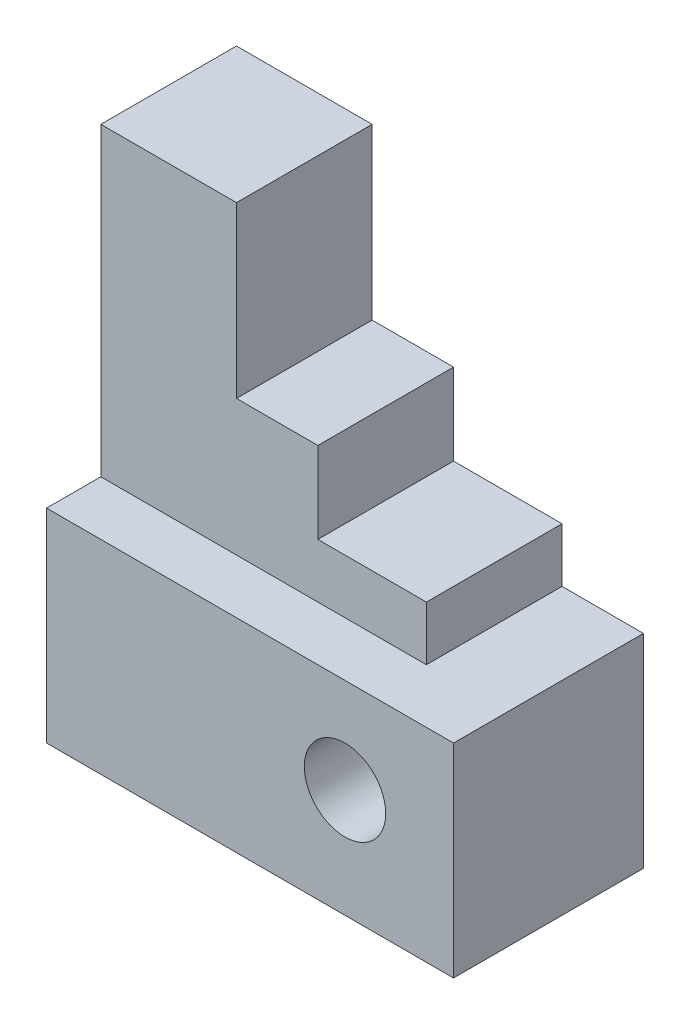
ISO-10303-21;
HEADER;
FILE_DESCRIPTION(('STEP AP214'),'2;1');
FILE_NAME('part.step','',(''),(''),'','','');
FILE_SCHEMA(('AUTOMOTIVE_DESIGN { 1 0 10303 214 1 1 1 1 }'));
ENDSEC;
DATA;
#1=APPLICATION_CONTEXT('core data for automotive mechanical design processes');
#2=APPLICATION_PROTOCOL_DEFINITION('international standard','automotive_design',2000,#1);
#3=PRODUCT_CONTEXT('',#1,'mechanical');
#4=PRODUCT('Part','Part','',(#3));
#5=PRODUCT_RELATED_PRODUCT_CATEGORY('part','',(#4));
#6=PRODUCT_DEFINITION_FORMATION('','',#4);
#7=PRODUCT_DEFINITION_CONTEXT('part definition',#1,'design');
#8=PRODUCT_DEFINITION('design','',#6,#7);
#9=PRODUCT_DEFINITION_SHAPE('','',#8);
#10=(LENGTH_UNIT() NAMED_UNIT(*) SI_UNIT(.MILLI.,.METRE.));
#11=(NAMED_UNIT(*) PLANE_ANGLE_UNIT() SI_UNIT($,.RADIAN.));
#12=(NAMED_UNIT(*) SI_UNIT($,.STERADIAN.) SOLID_ANGLE_UNIT());
#13=UNCERTAINTY_MEASURE_WITH_UNIT(LENGTH_MEASURE(1.E-05),#10,'distance_accuracy_value','');
#14=(GEOMETRIC_REPRESENTATION_CONTEXT(3) GLOBAL_UNCERTAINTY_ASSIGNED_CONTEXT((#13)) GLOBAL_UNIT_ASSIGNED_CONTEXT((#10,
#11,#12)) REPRESENTATION_CONTEXT('',''));
#15=CARTESIAN_POINT('',(0.,0.,0.));
#16=DIRECTION('',(0.,0.,1.));
#17=DIRECTION('',(1.,0.,0.));
#18=AXIS2_PLACEMENT_3D('',#15,#16,#17);
#19=CARTESIAN_POINT('',(0.,30.,28.));
#20=DIRECTION('',(0.,-1.,0.));
#21=DIRECTION('',(1.,0.,0.));
#22=AXIS2_PLACEMENT_3D('',#19,#20,#21);
#23=PLANE('',#22);
#24=DIRECTION('',(0.,0.,-1.));
#25=VECTOR('',#24,1.);
#26=CARTESIAN_POINT('',(48.,30.,20.));
#27=LINE('',#26,#25);
#28=CARTESIAN_POINT('',(48.,30.,20.));
#29=VERTEX_POINT('',#28);
#30=CARTESIAN_POINT('',(48.,30.,0.));
#31=VERTEX_POINT('',#30);
#32=EDGE_CURVE('E190',#29,#31,#27,.T.);
#33=ORIENTED_EDGE('',*,*,#32,.F.);
#34=DIRECTION('',(-1.,0.,0.));
#35=VECTOR('',#34,1.);
#36=CARTESIAN_POINT('',(0.,30.,20.));
#37=LINE('',#36,#35);
#38=CARTESIAN_POINT('',(0.,30.,20.));
#39=VERTEX_POINT('',#38);
#40=EDGE_CURVE('E162',#29,#39,#37,.T.);
#41=ORIENTED_EDGE('',*,*,#40,.T.);
#42=DIRECTION('',(0.,0.,-1.));
#43=VECTOR('',#42,1.);
#44=CARTESIAN_POINT('',(0.,30.,28.));
#45=LINE('',#44,#43);
#46=CARTESIAN_POINT('',(0.,30.,28.));
#47=VERTEX_POINT('',#46);
#48=EDGE_CURVE('E11',#47,#39,#45,.T.);
#49=ORIENTED_EDGE('',*,*,#48,.F.);
#50=DIRECTION('',(-1.,0.,0.));
#51=VECTOR('',#50,1.);
#52=CARTESIAN_POINT('',(0.,30.,28.));
#53=LINE('',#52,#51);
#54=CARTESIAN_POINT('',(60.,30.,28.));
#55=VERTEX_POINT('',#54);
#56=EDGE_CURVE('E232',#55,#47,#53,.T.);
#57=ORIENTED_EDGE('',*,*,#56,.F.);
#58=DIRECTION('',(0.,0.,-1.));
#59=VECTOR('',#58,1.);
#60=CARTESIAN_POINT('',(60.,30.,28.));
#61=LINE('',#60,#59);
#62=CARTESIAN_POINT('',(60.,30.,0.));
#63=VERTEX_POINT('',#62);
#64=EDGE_CURVE('E242',#55,#63,#61,.T.);
#65=ORIENTED_EDGE('',*,*,#64,.T.);
#66=DIRECTION('',(-1.,0.,0.));
#67=VECTOR('',#66,1.);
#68=CARTESIAN_POINT('',(0.,30.,0.));
#69=LINE('',#68,#67);
#70=EDGE_CURVE('E246',#63,#31,#69,.T.);
#71=ORIENTED_EDGE('',*,*,#70,.T.);
#72=EDGE_LOOP('',(#33,#41,#49,#57,#65,#71));
#73=FACE_BOUND('',#72,.T.);
#74=ADVANCED_FACE('F49',(#73),#23,.F.);
#75=CARTESIAN_POINT('',(0.,0.,28.));
#76=DIRECTION('',(1.,0.,0.));
#77=DIRECTION('',(0.,0.,-1.));
#78=AXIS2_PLACEMENT_3D('',#75,#76,#77);
#79=PLANE('',#78);
#80=DIRECTION('',(0.,-1.,0.));
#81=VECTOR('',#80,1.);
#82=CARTESIAN_POINT('',(0.,0.,0.));
#83=LINE('',#82,#81);
#84=CARTESIAN_POINT('',(0.,75.,0.));
#85=VERTEX_POINT('',#84);
#86=CARTESIAN_POINT('',(0.,0.,0.));
#87=VERTEX_POINT('',#86);
#88=EDGE_CURVE('E250',#85,#87,#83,.T.);
#89=ORIENTED_EDGE('',*,*,#88,.T.);
#90=DIRECTION('',(0.,0.,-1.));
#91=VECTOR('',#90,1.);
#92=CARTESIAN_POINT('',(0.,0.,28.));
#93=LINE('',#92,#91);
#94=CARTESIAN_POINT('',(0.,0.,28.));
#95=VERTEX_POINT('',#94);
#96=EDGE_CURVE('E58',#95,#87,#93,.T.);
#97=ORIENTED_EDGE('',*,*,#96,.F.);
#98=DIRECTION('',(0.,-1.,0.));
#99=VECTOR('',#98,1.);
#100=CARTESIAN_POINT('',(0.,0.,28.));
#101=LINE('',#100,#99);
#102=EDGE_CURVE('E99',#47,#95,#101,.T.);
#103=ORIENTED_EDGE('',*,*,#102,.F.);
#104=ORIENTED_EDGE('',*,*,#48,.T.);
#105=DIRECTION('',(0.,1.,0.));
#106=VECTOR('',#105,1.);
#107=CARTESIAN_POINT('',(0.,0.,20.));
#108=LINE('',#107,#106);
#109=CARTESIAN_POINT('',(0.,75.,20.));
#110=VERTEX_POINT('',#109);
#111=EDGE_CURVE('E65',#39,#110,#108,.T.);
#112=ORIENTED_EDGE('',*,*,#111,.T.);
#113=DIRECTION('',(0.,0.,-1.));
#114=VECTOR('',#113,1.);
#115=CARTESIAN_POINT('',(0.,75.,20.));
#116=LINE('',#115,#114);
#117=EDGE_CURVE('E213',#110,#85,#116,.T.);
#118=ORIENTED_EDGE('',*,*,#117,.T.);
#119=EDGE_LOOP('',(#89,#97,#103,#104,#112,#118));
#120=FACE_BOUND('',#119,.T.);
#121=ADVANCED_FACE('F289',(#120),#79,.F.);
#122=CARTESIAN_POINT('',(0.,0.,28.));
#123=DIRECTION('',(0.,1.,0.));
#124=DIRECTION('',(0.,0.,1.));
#125=AXIS2_PLACEMENT_3D('',#122,#123,#124);
#126=PLANE('',#125);
#127=DIRECTION('',(1.,0.,0.));
#128=VECTOR('',#127,1.);
#129=CARTESIAN_POINT('',(0.,0.,0.));
#130=LINE('',#129,#128);
#131=CARTESIAN_POINT('',(60.,0.,0.));
#132=VERTEX_POINT('',#131);
#133=EDGE_CURVE('E253',#87,#132,#130,.T.);
#134=ORIENTED_EDGE('',*,*,#133,.T.);
#135=DIRECTION('',(0.,0.,-1.));
#136=VECTOR('',#135,1.);
#137=CARTESIAN_POINT('',(60.,0.,28.));
#138=LINE('',#137,#136);
#139=CARTESIAN_POINT('',(60.,0.,28.));
#140=VERTEX_POINT('',#139);
#141=EDGE_CURVE('E260',#140,#132,#138,.T.);
#142=ORIENTED_EDGE('',*,*,#141,.F.);
#143=DIRECTION('',(1.,0.,0.));
#144=VECTOR('',#143,1.);
#145=CARTESIAN_POINT('',(0.,0.,28.));
#146=LINE('',#145,#144);
#147=EDGE_CURVE('E237',#95,#140,#146,.T.);
#148=ORIENTED_EDGE('',*,*,#147,.F.);
#149=ORIENTED_EDGE('',*,*,#96,.T.);
#150=EDGE_LOOP('',(#134,#142,#148,#149));
#151=FACE_BOUND('',#150,.T.);
#152=ADVANCED_FACE('F267',(#151),#126,.F.);
#153=CARTESIAN_POINT('',(44.,16.,28.));
#154=DIRECTION('',(0.,0.,-1.));
#155=DIRECTION('',(-1.,0.,0.));
#156=AXIS2_PLACEMENT_3D('',#153,#154,#155);
#157=CYLINDRICAL_SURFACE('',#156,5.99999999999999);
#158=CARTESIAN_POINT('',(44.,16.,28.));
#159=DIRECTION('',(0.,0.,1.));
#160=DIRECTION('',(1.,0.,0.));
#161=AXIS2_PLACEMENT_3D('',#158,#159,#160);
#162=CIRCLE('',#161,5.99999999999999);
#163=CARTESIAN_POINT('',(50.,16.,28.));
#164=VERTEX_POINT('',#163);
#165=EDGE_CURVE('E228',#164,#164,#162,.T.);
#166=ORIENTED_EDGE('',*,*,#165,.T.);
#167=EDGE_LOOP('',(#166));
#168=FACE_BOUND('',#167,.T.);
#169=CARTESIAN_POINT('',(44.,16.,0.));
#170=DIRECTION('',(0.,0.,1.));
#171=DIRECTION('',(1.,0.,0.));
#172=AXIS2_PLACEMENT_3D('',#169,#170,#171);
#173=CIRCLE('',#172,5.99999999999999);
#174=CARTESIAN_POINT('',(50.,16.,0.));
#175=VERTEX_POINT('',#174);
#176=EDGE_CURVE('E154',#175,#175,#173,.T.);
#177=ORIENTED_EDGE('',*,*,#176,.F.);
#178=EDGE_LOOP('',(#177));
#179=FACE_BOUND('',#178,.T.);
#180=ADVANCED_FACE('F51',(#168,#179),#157,.F.);
#181=CARTESIAN_POINT('',(60.,0.,28.));
#182=DIRECTION('',(-1.,0.,0.));
#183=DIRECTION('',(0.,0.,1.));
#184=AXIS2_PLACEMENT_3D('',#181,#182,#183);
#185=PLANE('',#184);
#186=DIRECTION('',(0.,1.,0.));
#187=VECTOR('',#186,1.);
#188=CARTESIAN_POINT('',(60.,0.,0.));
#189=LINE('',#188,#187);
#190=EDGE_CURVE('E92',#132,#63,#189,.T.);
#191=ORIENTED_EDGE('',*,*,#190,.T.);
#192=ORIENTED_EDGE('',*,*,#64,.F.);
#193=DIRECTION('',(0.,1.,0.));
#194=VECTOR('',#193,1.);
#195=CARTESIAN_POINT('',(60.,0.,28.));
#196=LINE('',#195,#194);
#197=EDGE_CURVE('E74',#140,#55,#196,.T.);
#198=ORIENTED_EDGE('',*,*,#197,.F.);
#199=ORIENTED_EDGE('',*,*,#141,.T.);
#200=EDGE_LOOP('',(#191,#192,#198,#199));
#201=FACE_BOUND('',#200,.T.);
#202=ADVANCED_FACE('F275',(#201),#185,.F.);
#203=CARTESIAN_POINT('',(0.,0.,28.));
#204=DIRECTION('',(0.,0.,1.));
#205=DIRECTION('',(1.,0.,0.));
#206=AXIS2_PLACEMENT_3D('',#203,#204,#205);
#207=PLANE('',#206);
#208=ORIENTED_EDGE('',*,*,#165,.F.);
#209=EDGE_LOOP('',(#208));
#210=FACE_BOUND('',#209,.T.);
#211=ORIENTED_EDGE('',*,*,#56,.T.);
#212=ORIENTED_EDGE('',*,*,#102,.T.);
#213=ORIENTED_EDGE('',*,*,#147,.T.);
#214=ORIENTED_EDGE('',*,*,#197,.T.);
#215=EDGE_LOOP('',(#211,#212,#213,#214));
#216=FACE_BOUND('',#215,.T.);
#217=ADVANCED_FACE('F277',(#210,#216),#207,.T.);
#218=CARTESIAN_POINT('',(0.,0.,0.));
#219=DIRECTION('',(0.,0.,1.));
#220=DIRECTION('',(1.,0.,0.));
#221=AXIS2_PLACEMENT_3D('',#218,#219,#220);
#222=PLANE('',#221);
#223=ORIENTED_EDGE('',*,*,#176,.T.);
#224=EDGE_LOOP('',(#223));
#225=FACE_BOUND('',#224,.T.);
#226=ORIENTED_EDGE('',*,*,#70,.F.);
#227=ORIENTED_EDGE('',*,*,#190,.F.);
#228=ORIENTED_EDGE('',*,*,#133,.F.);
#229=ORIENTED_EDGE('',*,*,#88,.F.);
#230=DIRECTION('',(1.,0.,0.));
#231=VECTOR('',#230,1.);
#232=CARTESIAN_POINT('',(0.,75.,0.));
#233=LINE('',#232,#231);
#234=CARTESIAN_POINT('',(20.,75.,0.));
#235=VERTEX_POINT('',#234);
#236=EDGE_CURVE('E165',#85,#235,#233,.T.);
#237=ORIENTED_EDGE('',*,*,#236,.T.);
#238=DIRECTION('',(0.,-1.,0.));
#239=VECTOR('',#238,1.);
#240=CARTESIAN_POINT('',(20.,0.,0.));
#241=LINE('',#240,#239);
#242=CARTESIAN_POINT('',(20.,50.,0.));
#243=VERTEX_POINT('',#242);
#244=EDGE_CURVE('E204',#235,#243,#241,.T.);
#245=ORIENTED_EDGE('',*,*,#244,.T.);
#246=DIRECTION('',(1.,0.,0.));
#247=VECTOR('',#246,1.);
#248=CARTESIAN_POINT('',(0.,50.,0.));
#249=LINE('',#248,#247);
#250=CARTESIAN_POINT('',(32.,50.,0.));
#251=VERTEX_POINT('',#250);
#252=EDGE_CURVE('E200',#243,#251,#249,.T.);
#253=ORIENTED_EDGE('',*,*,#252,.T.);
#254=DIRECTION('',(0.,-1.,0.));
#255=VECTOR('',#254,1.);
#256=CARTESIAN_POINT('',(32.,0.,0.));
#257=LINE('',#256,#255);
#258=CARTESIAN_POINT('',(32.,38.,0.));
#259=VERTEX_POINT('',#258);
#260=EDGE_CURVE('E196',#251,#259,#257,.T.);
#261=ORIENTED_EDGE('',*,*,#260,.T.);
#262=DIRECTION('',(1.,0.,0.));
#263=VECTOR('',#262,1.);
#264=CARTESIAN_POINT('',(0.,38.,0.));
#265=LINE('',#264,#263);
#266=CARTESIAN_POINT('',(48.,38.,0.));
#267=VERTEX_POINT('',#266);
#268=EDGE_CURVE('E193',#259,#267,#265,.T.);
#269=ORIENTED_EDGE('',*,*,#268,.T.);
#270=DIRECTION('',(0.,-1.,0.));
#271=VECTOR('',#270,1.);
#272=CARTESIAN_POINT('',(48.,0.,0.));
#273=LINE('',#272,#271);
#274=EDGE_CURVE('E148',#267,#31,#273,.T.);
#275=ORIENTED_EDGE('',*,*,#274,.T.);
#276=EDGE_LOOP('',(#226,#227,#228,#229,#237,#245,#253,#261,#269,#275));
#277=FACE_BOUND('',#276,.T.);
#278=ADVANCED_FACE('F271',(#225,#277),#222,.F.);
#279=CARTESIAN_POINT('',(48.,0.,20.));
#280=DIRECTION('',(1.,0.,0.));
#281=DIRECTION('',(0.,0.,-1.));
#282=AXIS2_PLACEMENT_3D('',#279,#280,#281);
#283=PLANE('',#282);
#284=ORIENTED_EDGE('',*,*,#274,.F.);
#285=DIRECTION('',(0.,0.,-1.));
#286=VECTOR('',#285,1.);
#287=CARTESIAN_POINT('',(48.,38.,20.));
#288=LINE('',#287,#286);
#289=CARTESIAN_POINT('',(48.,38.,20.));
#290=VERTEX_POINT('',#289);
#291=EDGE_CURVE('E143',#290,#267,#288,.T.);
#292=ORIENTED_EDGE('',*,*,#291,.F.);
#293=DIRECTION('',(0.,-1.,0.));
#294=VECTOR('',#293,1.);
#295=CARTESIAN_POINT('',(48.,0.,20.));
#296=LINE('',#295,#294);
#297=EDGE_CURVE('E146',#290,#29,#296,.T.);
#298=ORIENTED_EDGE('',*,*,#297,.T.);
#299=ORIENTED_EDGE('',*,*,#32,.T.);
#300=EDGE_LOOP('',(#284,#292,#298,#299));
#301=FACE_BOUND('',#300,.T.);
#302=ADVANCED_FACE('F145',(#301),#283,.T.);
#303=CARTESIAN_POINT('',(0.,38.,20.));
#304=DIRECTION('',(0.,1.,0.));
#305=DIRECTION('',(0.,0.,1.));
#306=AXIS2_PLACEMENT_3D('',#303,#304,#305);
#307=PLANE('',#306);
#308=ORIENTED_EDGE('',*,*,#268,.F.);
#309=DIRECTION('',(0.,0.,-1.));
#310=VECTOR('',#309,1.);
#311=CARTESIAN_POINT('',(32.,38.,20.));
#312=LINE('',#311,#310);
#313=CARTESIAN_POINT('',(32.,38.,20.));
#314=VERTEX_POINT('',#313);
#315=EDGE_CURVE('E155',#314,#259,#312,.T.);
#316=ORIENTED_EDGE('',*,*,#315,.F.);
#317=DIRECTION('',(1.,0.,0.));
#318=VECTOR('',#317,1.);
#319=CARTESIAN_POINT('',(0.,38.,20.));
#320=LINE('',#319,#318);
#321=EDGE_CURVE('E160',#314,#290,#320,.T.);
#322=ORIENTED_EDGE('',*,*,#321,.T.);
#323=ORIENTED_EDGE('',*,*,#291,.T.);
#324=EDGE_LOOP('',(#308,#316,#322,#323));
#325=FACE_BOUND('',#324,.T.);
#326=ADVANCED_FACE('F167',(#325),#307,.T.);
#327=CARTESIAN_POINT('',(32.,0.,20.));
#328=DIRECTION('',(1.,0.,0.));
#329=DIRECTION('',(0.,1.,0.));
#330=AXIS2_PLACEMENT_3D('',#327,#328,#329);
#331=PLANE('',#330);
#332=ORIENTED_EDGE('',*,*,#260,.F.);
#333=DIRECTION('',(0.,0.,-1.));
#334=VECTOR('',#333,1.);
#335=CARTESIAN_POINT('',(32.,50.,20.));
#336=LINE('',#335,#334);
#337=CARTESIAN_POINT('',(32.,50.,20.));
#338=VERTEX_POINT('',#337);
#339=EDGE_CURVE('E223',#338,#251,#336,.T.);
#340=ORIENTED_EDGE('',*,*,#339,.F.);
#341=DIRECTION('',(0.,-1.,0.));
#342=VECTOR('',#341,1.);
#343=CARTESIAN_POINT('',(32.,0.,20.));
#344=LINE('',#343,#342);
#345=EDGE_CURVE('E169',#338,#314,#344,.T.);
#346=ORIENTED_EDGE('',*,*,#345,.T.);
#347=ORIENTED_EDGE('',*,*,#315,.T.);
#348=EDGE_LOOP('',(#332,#340,#346,#347));
#349=FACE_BOUND('',#348,.T.);
#350=ADVANCED_FACE('F350',(#349),#331,.T.);
#351=CARTESIAN_POINT('',(0.,50.,20.));
#352=DIRECTION('',(0.,1.,0.));
#353=DIRECTION('',(0.,0.,1.));
#354=AXIS2_PLACEMENT_3D('',#351,#352,#353);
#355=PLANE('',#354);
#356=ORIENTED_EDGE('',*,*,#252,.F.);
#357=DIRECTION('',(0.,0.,-1.));
#358=VECTOR('',#357,1.);
#359=CARTESIAN_POINT('',(20.,50.,20.));
#360=LINE('',#359,#358);
#361=CARTESIAN_POINT('',(20.,50.,20.));
#362=VERTEX_POINT('',#361);
#363=EDGE_CURVE('E220',#362,#243,#360,.T.);
#364=ORIENTED_EDGE('',*,*,#363,.F.);
#365=DIRECTION('',(1.,0.,0.));
#366=VECTOR('',#365,1.);
#367=CARTESIAN_POINT('',(0.,50.,20.));
#368=LINE('',#367,#366);
#369=EDGE_CURVE('E172',#362,#338,#368,.T.);
#370=ORIENTED_EDGE('',*,*,#369,.T.);
#371=ORIENTED_EDGE('',*,*,#339,.T.);
#372=EDGE_LOOP('',(#356,#364,#370,#371));
#373=FACE_BOUND('',#372,.T.);
#374=ADVANCED_FACE('F358',(#373),#355,.T.);
#375=CARTESIAN_POINT('',(20.,0.,20.));
#376=DIRECTION('',(1.,0.,0.));
#377=DIRECTION('',(0.,1.,0.));
#378=AXIS2_PLACEMENT_3D('',#375,#376,#377);
#379=PLANE('',#378);
#380=ORIENTED_EDGE('',*,*,#244,.F.);
#381=DIRECTION('',(0.,0.,-1.));
#382=VECTOR('',#381,1.);
#383=CARTESIAN_POINT('',(20.,75.,20.));
#384=LINE('',#383,#382);
#385=CARTESIAN_POINT('',(20.,75.,20.));
#386=VERTEX_POINT('',#385);
#387=EDGE_CURVE('E217',#386,#235,#384,.T.);
#388=ORIENTED_EDGE('',*,*,#387,.F.);
#389=DIRECTION('',(0.,-1.,0.));
#390=VECTOR('',#389,1.);
#391=CARTESIAN_POINT('',(20.,0.,20.));
#392=LINE('',#391,#390);
#393=EDGE_CURVE('E178',#386,#362,#392,.T.);
#394=ORIENTED_EDGE('',*,*,#393,.T.);
#395=ORIENTED_EDGE('',*,*,#363,.T.);
#396=EDGE_LOOP('',(#380,#388,#394,#395));
#397=FACE_BOUND('',#396,.T.);
#398=ADVANCED_FACE('F367',(#397),#379,.T.);
#399=CARTESIAN_POINT('',(0.,75.,20.));
#400=DIRECTION('',(0.,1.,0.));
#401=DIRECTION('',(0.,0.,1.));
#402=AXIS2_PLACEMENT_3D('',#399,#400,#401);
#403=PLANE('',#402);
#404=ORIENTED_EDGE('',*,*,#236,.F.);
#405=ORIENTED_EDGE('',*,*,#117,.F.);
#406=DIRECTION('',(1.,0.,0.));
#407=VECTOR('',#406,1.);
#408=CARTESIAN_POINT('',(0.,75.,20.));
#409=LINE('',#408,#407);
#410=EDGE_CURVE('E182',#110,#386,#409,.T.);
#411=ORIENTED_EDGE('',*,*,#410,.T.);
#412=ORIENTED_EDGE('',*,*,#387,.T.);
#413=EDGE_LOOP('',(#404,#405,#411,#412));
#414=FACE_BOUND('',#413,.T.);
#415=ADVANCED_FACE('F376',(#414),#403,.T.);
#416=CARTESIAN_POINT('',(0.,0.,20.));
#417=DIRECTION('',(0.,0.,1.));
#418=DIRECTION('',(1.,0.,0.));
#419=AXIS2_PLACEMENT_3D('',#416,#417,#418);
#420=PLANE('',#419);
#421=ORIENTED_EDGE('',*,*,#297,.F.);
#422=ORIENTED_EDGE('',*,*,#321,.F.);
#423=ORIENTED_EDGE('',*,*,#345,.F.);
#424=ORIENTED_EDGE('',*,*,#369,.F.);
#425=ORIENTED_EDGE('',*,*,#393,.F.);
#426=ORIENTED_EDGE('',*,*,#410,.F.);
#427=ORIENTED_EDGE('',*,*,#111,.F.);
#428=ORIENTED_EDGE('',*,*,#40,.F.);
#429=EDGE_LOOP('',(#421,#422,#423,#424,#425,#426,#427,#428));
#430=FACE_BOUND('',#429,.T.);
#431=ADVANCED_FACE('F158',(#430),#420,.T.);
#432=CLOSED_SHELL('',(#74,#121,#152,#180,#202,#217,#278,#302,#326,#350,#374,#398,#415,#431));
#433=MANIFOLD_SOLID_BREP('B2',#432);
#434=ADVANCED_BREP_SHAPE_REPRESENTATION('',(#18,#433),#14);
#435=SHAPE_DEFINITION_REPRESENTATION(#9,#434);
ENDSEC;
END-ISO-10303-21;
